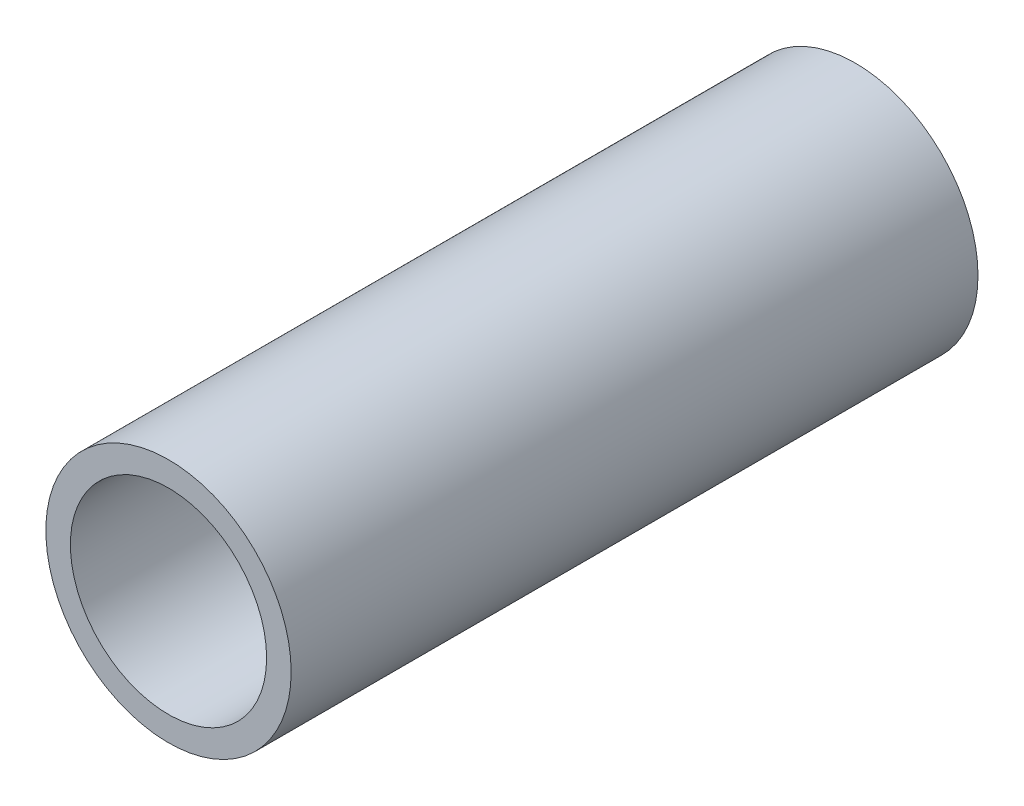
ISO-10303-21;
HEADER;
FILE_DESCRIPTION(('STEP AP214'),'2;1');
FILE_NAME('part.step','',(''),(''),'','','');
FILE_SCHEMA(('AUTOMOTIVE_DESIGN { 1 0 10303 214 1 1 1 1 }'));
ENDSEC;
DATA;
#1=APPLICATION_CONTEXT('core data for automotive mechanical design processes');
#2=APPLICATION_PROTOCOL_DEFINITION('international standard','automotive_design',2000,#1);
#3=PRODUCT_CONTEXT('',#1,'mechanical');
#4=PRODUCT('Part','Part','',(#3));
#5=PRODUCT_RELATED_PRODUCT_CATEGORY('part','',(#4));
#6=PRODUCT_DEFINITION_FORMATION('','',#4);
#7=PRODUCT_DEFINITION_CONTEXT('part definition',#1,'design');
#8=PRODUCT_DEFINITION('design','',#6,#7);
#9=PRODUCT_DEFINITION_SHAPE('','',#8);
#10=(LENGTH_UNIT() NAMED_UNIT(*) SI_UNIT(.MILLI.,.METRE.));
#11=(NAMED_UNIT(*) PLANE_ANGLE_UNIT() SI_UNIT($,.RADIAN.));
#12=(NAMED_UNIT(*) SI_UNIT($,.STERADIAN.) SOLID_ANGLE_UNIT());
#13=UNCERTAINTY_MEASURE_WITH_UNIT(LENGTH_MEASURE(1.E-05),#10,'distance_accuracy_value','');
#14=(GEOMETRIC_REPRESENTATION_CONTEXT(3) GLOBAL_UNCERTAINTY_ASSIGNED_CONTEXT((#13)) GLOBAL_UNIT_ASSIGNED_CONTEXT((#10,
#11,#12)) REPRESENTATION_CONTEXT('',''));
#15=CARTESIAN_POINT('',(0.,0.,0.));
#16=DIRECTION('',(0.,0.,1.));
#17=DIRECTION('',(1.,0.,0.));
#18=AXIS2_PLACEMENT_3D('',#15,#16,#17);
#19=CARTESIAN_POINT('',(0.,0.,22.225));
#20=DIRECTION('',(0.,0.,1.));
#21=DIRECTION('',(1.,0.,0.));
#22=AXIS2_PLACEMENT_3D('',#19,#20,#21);
#23=PLANE('',#22);
#24=CARTESIAN_POINT('',(0.,0.,22.225));
#25=DIRECTION('',(0.,0.,1.));
#26=DIRECTION('',(1.,0.,0.));
#27=AXIS2_PLACEMENT_3D('',#24,#25,#26);
#28=CIRCLE('',#27,7.9375);
#29=CARTESIAN_POINT('',(7.9375,0.,22.225));
#30=VERTEX_POINT('',#29);
#31=EDGE_CURVE('E10',#30,#30,#28,.T.);
#32=ORIENTED_EDGE('',*,*,#31,.T.);
#33=EDGE_LOOP('',(#32));
#34=FACE_BOUND('',#33,.T.);
#35=CARTESIAN_POINT('',(0.,0.,22.225));
#36=DIRECTION('',(0.,0.,1.));
#37=DIRECTION('',(1.,0.,0.));
#38=AXIS2_PLACEMENT_3D('',#35,#36,#37);
#39=CIRCLE('',#38,6.35);
#40=CARTESIAN_POINT('',(6.35,0.,22.225));
#41=VERTEX_POINT('',#40);
#42=EDGE_CURVE('E54',#41,#41,#39,.T.);
#43=ORIENTED_EDGE('',*,*,#42,.F.);
#44=EDGE_LOOP('',(#43));
#45=FACE_BOUND('',#44,.T.);
#46=ADVANCED_FACE('F41',(#34,#45),#23,.T.);
#47=CARTESIAN_POINT('',(0.,0.,-22.225));
#48=DIRECTION('',(0.,0.,1.));
#49=DIRECTION('',(1.,0.,0.));
#50=AXIS2_PLACEMENT_3D('',#47,#48,#49);
#51=PLANE('',#50);
#52=CARTESIAN_POINT('',(0.,0.,-22.225));
#53=DIRECTION('',(0.,0.,1.));
#54=DIRECTION('',(1.,0.,0.));
#55=AXIS2_PLACEMENT_3D('',#52,#53,#54);
#56=CIRCLE('',#55,7.9375);
#57=CARTESIAN_POINT('',(7.9375,0.,-22.225));
#58=VERTEX_POINT('',#57);
#59=EDGE_CURVE('E45',#58,#58,#56,.T.);
#60=ORIENTED_EDGE('',*,*,#59,.F.);
#61=EDGE_LOOP('',(#60));
#62=FACE_BOUND('',#61,.T.);
#63=CARTESIAN_POINT('',(0.,0.,-22.225));
#64=DIRECTION('',(0.,0.,1.));
#65=DIRECTION('',(1.,0.,0.));
#66=AXIS2_PLACEMENT_3D('',#63,#64,#65);
#67=CIRCLE('',#66,6.35);
#68=CARTESIAN_POINT('',(6.35,0.,-22.225));
#69=VERTEX_POINT('',#68);
#70=EDGE_CURVE('E56',#69,#69,#67,.T.);
#71=ORIENTED_EDGE('',*,*,#70,.T.);
#72=EDGE_LOOP('',(#71));
#73=FACE_BOUND('',#72,.T.);
#74=ADVANCED_FACE('F68',(#62,#73),#51,.F.);
#75=CARTESIAN_POINT('',(0.,0.,22.225));
#76=DIRECTION('',(0.,0.,-1.));
#77=DIRECTION('',(-1.,0.,0.));
#78=AXIS2_PLACEMENT_3D('',#75,#76,#77);
#79=CYLINDRICAL_SURFACE('',#78,7.9375);
#80=ORIENTED_EDGE('',*,*,#31,.F.);
#81=EDGE_LOOP('',(#80));
#82=FACE_BOUND('',#81,.T.);
#83=ORIENTED_EDGE('',*,*,#59,.T.);
#84=EDGE_LOOP('',(#83));
#85=FACE_BOUND('',#84,.T.);
#86=ADVANCED_FACE('F43',(#82,#85),#79,.T.);
#87=CARTESIAN_POINT('',(0.,0.,22.225));
#88=DIRECTION('',(0.,0.,-1.));
#89=DIRECTION('',(-1.,0.,0.));
#90=AXIS2_PLACEMENT_3D('',#87,#88,#89);
#91=CYLINDRICAL_SURFACE('',#90,6.35);
#92=ORIENTED_EDGE('',*,*,#42,.T.);
#93=EDGE_LOOP('',(#92));
#94=FACE_BOUND('',#93,.T.);
#95=ORIENTED_EDGE('',*,*,#70,.F.);
#96=EDGE_LOOP('',(#95));
#97=FACE_BOUND('',#96,.T.);
#98=ADVANCED_FACE('F64',(#94,#97),#91,.F.);
#99=CLOSED_SHELL('',(#46,#74,#86,#98));
#100=MANIFOLD_SOLID_BREP('B2',#99);
#101=ADVANCED_BREP_SHAPE_REPRESENTATION('',(#18,#100),#14);
#102=SHAPE_DEFINITION_REPRESENTATION(#9,#101);
ENDSEC;
END-ISO-10303-21;
